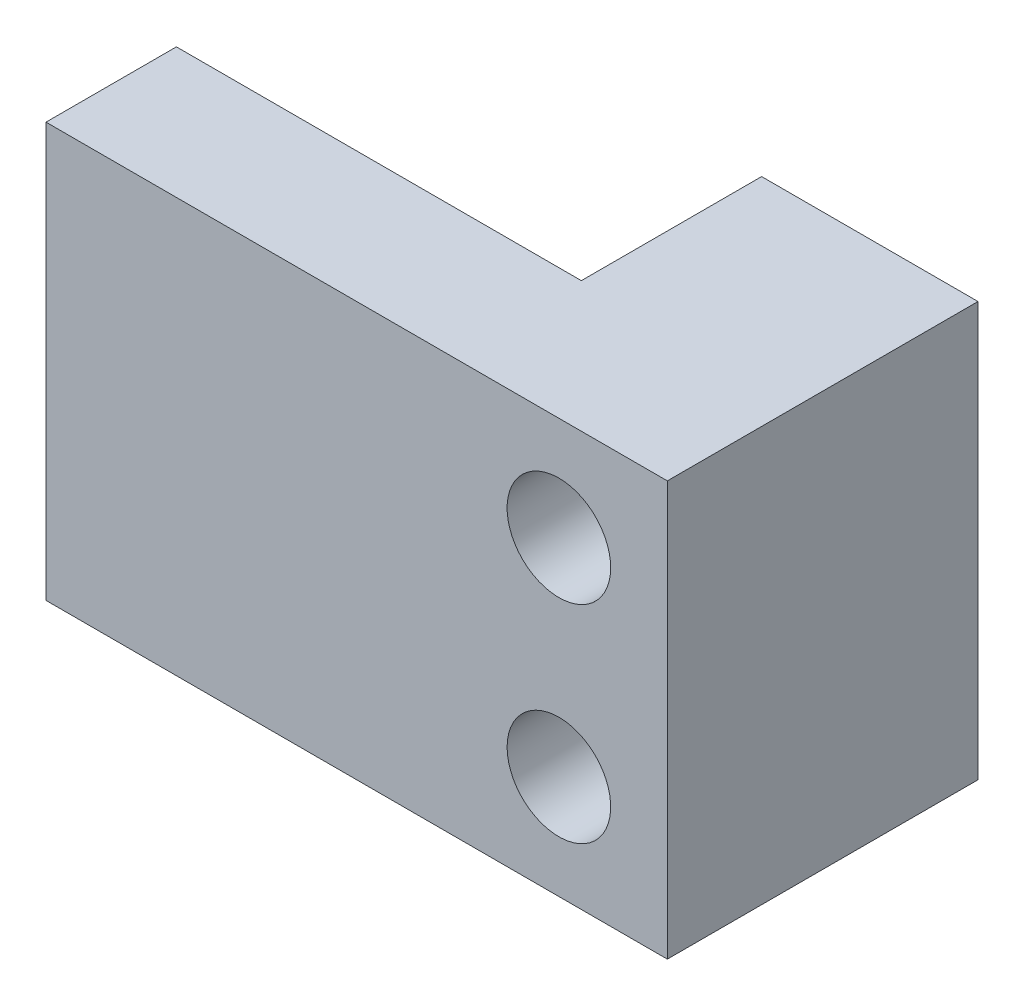
ISO-10303-21;
HEADER;
FILE_DESCRIPTION(('STEP AP214'),'2;1');
FILE_NAME('part.step','',(''),(''),'','','');
FILE_SCHEMA(('AUTOMOTIVE_DESIGN { 1 0 10303 214 1 1 1 1 }'));
ENDSEC;
DATA;
#1=APPLICATION_CONTEXT('core data for automotive mechanical design processes');
#2=APPLICATION_PROTOCOL_DEFINITION('international standard','automotive_design',2000,#1);
#3=PRODUCT_CONTEXT('',#1,'mechanical');
#4=PRODUCT('Part','Part','',(#3));
#5=PRODUCT_RELATED_PRODUCT_CATEGORY('part','',(#4));
#6=PRODUCT_DEFINITION_FORMATION('','',#4);
#7=PRODUCT_DEFINITION_CONTEXT('part definition',#1,'design');
#8=PRODUCT_DEFINITION('design','',#6,#7);
#9=PRODUCT_DEFINITION_SHAPE('','',#8);
#10=(LENGTH_UNIT() NAMED_UNIT(*) SI_UNIT(.MILLI.,.METRE.));
#11=(NAMED_UNIT(*) PLANE_ANGLE_UNIT() SI_UNIT($,.RADIAN.));
#12=(NAMED_UNIT(*) SI_UNIT($,.STERADIAN.) SOLID_ANGLE_UNIT());
#13=UNCERTAINTY_MEASURE_WITH_UNIT(LENGTH_MEASURE(1.E-05),#10,'distance_accuracy_value','');
#14=(GEOMETRIC_REPRESENTATION_CONTEXT(3) GLOBAL_UNCERTAINTY_ASSIGNED_CONTEXT((#13)) GLOBAL_UNIT_ASSIGNED_CONTEXT((#10,
#11,#12)) REPRESENTATION_CONTEXT('',''));
#15=CARTESIAN_POINT('',(0.,0.,0.));
#16=DIRECTION('',(0.,0.,1.));
#17=DIRECTION('',(1.,0.,0.));
#18=AXIS2_PLACEMENT_3D('',#15,#16,#17);
#19=CARTESIAN_POINT('',(0.,0.,15.));
#20=DIRECTION('',(0.,0.,-1.));
#21=DIRECTION('',(-1.,0.,0.));
#22=AXIS2_PLACEMENT_3D('',#19,#20,#21);
#23=PLANE('',#22);
#24=DIRECTION('',(0.,1.,0.));
#25=VECTOR('',#24,1.);
#26=CARTESIAN_POINT('',(15.,-10.,15.));
#27=LINE('',#26,#25);
#28=CARTESIAN_POINT('',(15.,-10.,15.));
#29=VERTEX_POINT('',#28);
#30=CARTESIAN_POINT('',(15.,10.,15.));
#31=VERTEX_POINT('',#30);
#32=EDGE_CURVE('E140',#29,#31,#27,.T.);
#33=ORIENTED_EDGE('',*,*,#32,.T.);
#34=DIRECTION('',(-1.,0.,0.));
#35=VECTOR('',#34,1.);
#36=CARTESIAN_POINT('',(-15.,9.99999999999999,15.));
#37=LINE('',#36,#35);
#38=CARTESIAN_POINT('',(-15.,9.99999999999999,15.));
#39=VERTEX_POINT('',#38);
#40=EDGE_CURVE('E82',#31,#39,#37,.T.);
#41=ORIENTED_EDGE('',*,*,#40,.T.);
#42=DIRECTION('',(0.,-1.,0.));
#43=VECTOR('',#42,1.);
#44=CARTESIAN_POINT('',(-15.,-10.,15.));
#45=LINE('',#44,#43);
#46=CARTESIAN_POINT('',(-15.,-10.,15.));
#47=VERTEX_POINT('',#46);
#48=EDGE_CURVE('E143',#39,#47,#45,.T.);
#49=ORIENTED_EDGE('',*,*,#48,.T.);
#50=DIRECTION('',(1.,0.,0.));
#51=VECTOR('',#50,1.);
#52=CARTESIAN_POINT('',(-15.,-10.,15.));
#53=LINE('',#52,#51);
#54=EDGE_CURVE('E57',#47,#29,#53,.T.);
#55=ORIENTED_EDGE('',*,*,#54,.T.);
#56=EDGE_LOOP('',(#33,#41,#49,#55));
#57=FACE_BOUND('',#56,.T.);
#58=CARTESIAN_POINT('',(9.76381369174453,4.99999999999999,15.));
#59=DIRECTION('',(0.,0.,1.));
#60=DIRECTION('',(1.,0.,0.));
#61=AXIS2_PLACEMENT_3D('',#58,#59,#60);
#62=CIRCLE('',#61,2.5);
#63=CARTESIAN_POINT('',(12.2638136917445,4.99999999999999,15.));
#64=VERTEX_POINT('',#63);
#65=EDGE_CURVE('E134',#64,#64,#62,.T.);
#66=ORIENTED_EDGE('',*,*,#65,.F.);
#67=EDGE_LOOP('',(#66));
#68=FACE_BOUND('',#67,.T.);
#69=CARTESIAN_POINT('',(9.76381369174452,-5.00000000000001,15.));
#70=DIRECTION('',(0.,0.,1.));
#71=DIRECTION('',(-1.,0.,0.));
#72=AXIS2_PLACEMENT_3D('',#69,#70,#71);
#73=CIRCLE('',#72,2.5);
#74=CARTESIAN_POINT('',(7.26381369174452,-5.00000000000001,15.));
#75=VERTEX_POINT('',#74);
#76=EDGE_CURVE('E127',#75,#75,#73,.T.);
#77=ORIENTED_EDGE('',*,*,#76,.F.);
#78=EDGE_LOOP('',(#77));
#79=FACE_BOUND('',#78,.T.);
#80=ADVANCED_FACE('F33',(#57,#68,#79),#23,.F.);
#81=CARTESIAN_POINT('',(0.,0.,0.));
#82=DIRECTION('',(0.,0.,-1.));
#83=DIRECTION('',(-1.,0.,0.));
#84=AXIS2_PLACEMENT_3D('',#81,#82,#83);
#85=PLANE('',#84);
#86=DIRECTION('',(0.,1.,0.));
#87=VECTOR('',#86,1.);
#88=CARTESIAN_POINT('',(4.55213166299018,-1.,0.));
#89=LINE('',#88,#87);
#90=CARTESIAN_POINT('',(4.55213166299018,-1.,0.));
#91=VERTEX_POINT('',#90);
#92=CARTESIAN_POINT('',(4.55213166299018,9.99999999999999,0.));
#93=VERTEX_POINT('',#92);
#94=EDGE_CURVE('E122',#91,#93,#89,.T.);
#95=ORIENTED_EDGE('',*,*,#94,.T.);
#96=DIRECTION('',(-1.,0.,0.));
#97=VECTOR('',#96,1.);
#98=CARTESIAN_POINT('',(-15.,9.99999999999999,0.));
#99=LINE('',#98,#97);
#100=CARTESIAN_POINT('',(15.,10.,0.));
#101=VERTEX_POINT('',#100);
#102=EDGE_CURVE('E149',#101,#93,#99,.T.);
#103=ORIENTED_EDGE('',*,*,#102,.F.);
#104=DIRECTION('',(0.,1.,0.));
#105=VECTOR('',#104,1.);
#106=CARTESIAN_POINT('',(15.,-10.,0.));
#107=LINE('',#106,#105);
#108=CARTESIAN_POINT('',(15.,-10.,0.));
#109=VERTEX_POINT('',#108);
#110=EDGE_CURVE('E137',#109,#101,#107,.T.);
#111=ORIENTED_EDGE('',*,*,#110,.F.);
#112=DIRECTION('',(1.,0.,0.));
#113=VECTOR('',#112,1.);
#114=CARTESIAN_POINT('',(-15.,-10.,0.));
#115=LINE('',#114,#113);
#116=CARTESIAN_POINT('',(-15.,-10.,0.));
#117=VERTEX_POINT('',#116);
#118=EDGE_CURVE('E75',#117,#109,#115,.T.);
#119=ORIENTED_EDGE('',*,*,#118,.F.);
#120=DIRECTION('',(0.,-1.,0.));
#121=VECTOR('',#120,1.);
#122=CARTESIAN_POINT('',(-15.,-10.,0.));
#123=LINE('',#122,#121);
#124=CARTESIAN_POINT('',(-15.,-1.00000000000001,0.));
#125=VERTEX_POINT('',#124);
#126=EDGE_CURVE('E152',#125,#117,#123,.T.);
#127=ORIENTED_EDGE('',*,*,#126,.F.);
#128=DIRECTION('',(-1.,0.,0.));
#129=VECTOR('',#128,1.);
#130=CARTESIAN_POINT('',(-15.,-1.00000000000001,0.));
#131=LINE('',#130,#129);
#132=EDGE_CURVE('E48',#91,#125,#131,.T.);
#133=ORIENTED_EDGE('',*,*,#132,.F.);
#134=EDGE_LOOP('',(#95,#103,#111,#119,#127,#133));
#135=FACE_BOUND('',#134,.T.);
#136=CARTESIAN_POINT('',(9.76381369174453,4.99999999999999,0.));
#137=DIRECTION('',(0.,0.,1.));
#138=DIRECTION('',(1.,0.,0.));
#139=AXIS2_PLACEMENT_3D('',#136,#137,#138);
#140=CIRCLE('',#139,2.5);
#141=CARTESIAN_POINT('',(12.2638136917445,4.99999999999999,0.));
#142=VERTEX_POINT('',#141);
#143=EDGE_CURVE('E130',#142,#142,#140,.T.);
#144=ORIENTED_EDGE('',*,*,#143,.T.);
#145=EDGE_LOOP('',(#144));
#146=FACE_BOUND('',#145,.T.);
#147=CARTESIAN_POINT('',(9.76381369174452,-5.00000000000001,0.));
#148=DIRECTION('',(0.,0.,1.));
#149=DIRECTION('',(-1.,0.,0.));
#150=AXIS2_PLACEMENT_3D('',#147,#148,#149);
#151=CIRCLE('',#150,2.5);
#152=CARTESIAN_POINT('',(7.26381369174452,-5.00000000000001,0.));
#153=VERTEX_POINT('',#152);
#154=EDGE_CURVE('E131',#153,#153,#151,.T.);
#155=ORIENTED_EDGE('',*,*,#154,.T.);
#156=EDGE_LOOP('',(#155));
#157=FACE_BOUND('',#156,.T.);
#158=ADVANCED_FACE('F162',(#135,#146,#157),#85,.T.);
#159=CARTESIAN_POINT('',(15.,-10.,15.));
#160=DIRECTION('',(-1.,0.,0.));
#161=DIRECTION('',(0.,-1.,0.));
#162=AXIS2_PLACEMENT_3D('',#159,#160,#161);
#163=PLANE('',#162);
#164=ORIENTED_EDGE('',*,*,#110,.T.);
#165=DIRECTION('',(0.,0.,-1.));
#166=VECTOR('',#165,1.);
#167=CARTESIAN_POINT('',(15.,10.,15.));
#168=LINE('',#167,#166);
#169=EDGE_CURVE('E11',#31,#101,#168,.T.);
#170=ORIENTED_EDGE('',*,*,#169,.F.);
#171=ORIENTED_EDGE('',*,*,#32,.F.);
#172=DIRECTION('',(0.,0.,-1.));
#173=VECTOR('',#172,1.);
#174=CARTESIAN_POINT('',(15.,-10.,15.));
#175=LINE('',#174,#173);
#176=EDGE_CURVE('E146',#29,#109,#175,.T.);
#177=ORIENTED_EDGE('',*,*,#176,.T.);
#178=EDGE_LOOP('',(#164,#170,#171,#177));
#179=FACE_BOUND('',#178,.T.);
#180=ADVANCED_FACE('F35',(#179),#163,.F.);
#181=CARTESIAN_POINT('',(-15.,9.99999999999999,15.));
#182=DIRECTION('',(0.,-1.,0.));
#183=DIRECTION('',(1.,0.,0.));
#184=AXIS2_PLACEMENT_3D('',#181,#182,#183);
#185=PLANE('',#184);
#186=ORIENTED_EDGE('',*,*,#102,.T.);
#187=DIRECTION('',(0.,0.,-1.));
#188=VECTOR('',#187,1.);
#189=CARTESIAN_POINT('',(4.55213166299018,9.99999999999999,0.));
#190=LINE('',#189,#188);
#191=CARTESIAN_POINT('',(4.55213166299018,9.99999999999999,8.70327388733472));
#192=VERTEX_POINT('',#191);
#193=EDGE_CURVE('E116',#192,#93,#190,.T.);
#194=ORIENTED_EDGE('',*,*,#193,.F.);
#195=DIRECTION('',(1.,0.,0.));
#196=VECTOR('',#195,1.);
#197=CARTESIAN_POINT('',(-15.,9.99999999999999,8.70327388733472));
#198=LINE('',#197,#196);
#199=CARTESIAN_POINT('',(-15.,9.99999999999999,8.70327388733472));
#200=VERTEX_POINT('',#199);
#201=EDGE_CURVE('E170',#200,#192,#198,.T.);
#202=ORIENTED_EDGE('',*,*,#201,.F.);
#203=DIRECTION('',(0.,0.,-1.));
#204=VECTOR('',#203,1.);
#205=CARTESIAN_POINT('',(-15.,9.99999999999999,15.));
#206=LINE('',#205,#204);
#207=EDGE_CURVE('E41',#39,#200,#206,.T.);
#208=ORIENTED_EDGE('',*,*,#207,.F.);
#209=ORIENTED_EDGE('',*,*,#40,.F.);
#210=ORIENTED_EDGE('',*,*,#169,.T.);
#211=EDGE_LOOP('',(#186,#194,#202,#208,#209,#210));
#212=FACE_BOUND('',#211,.T.);
#213=ADVANCED_FACE('F168',(#212),#185,.F.);
#214=CARTESIAN_POINT('',(-15.,-10.,15.));
#215=DIRECTION('',(1.,0.,0.));
#216=DIRECTION('',(0.,1.,0.));
#217=AXIS2_PLACEMENT_3D('',#214,#215,#216);
#218=PLANE('',#217);
#219=ORIENTED_EDGE('',*,*,#207,.T.);
#220=DIRECTION('',(0.,1.,0.));
#221=VECTOR('',#220,1.);
#222=CARTESIAN_POINT('',(-15.,-1.00000000000001,8.70327388733472));
#223=LINE('',#222,#221);
#224=CARTESIAN_POINT('',(-15.,-1.00000000000001,8.70327388733472));
#225=VERTEX_POINT('',#224);
#226=EDGE_CURVE('E106',#225,#200,#223,.T.);
#227=ORIENTED_EDGE('',*,*,#226,.F.);
#228=DIRECTION('',(0.,0.,1.));
#229=VECTOR('',#228,1.);
#230=CARTESIAN_POINT('',(-15.,-1.00000000000001,0.));
#231=LINE('',#230,#229);
#232=EDGE_CURVE('E111',#125,#225,#231,.T.);
#233=ORIENTED_EDGE('',*,*,#232,.F.);
#234=ORIENTED_EDGE('',*,*,#126,.T.);
#235=DIRECTION('',(0.,0.,-1.));
#236=VECTOR('',#235,1.);
#237=CARTESIAN_POINT('',(-15.,-10.,15.));
#238=LINE('',#237,#236);
#239=EDGE_CURVE('E156',#47,#117,#238,.T.);
#240=ORIENTED_EDGE('',*,*,#239,.F.);
#241=ORIENTED_EDGE('',*,*,#48,.F.);
#242=EDGE_LOOP('',(#219,#227,#233,#234,#240,#241));
#243=FACE_BOUND('',#242,.T.);
#244=ADVANCED_FACE('F119',(#243),#218,.F.);
#245=CARTESIAN_POINT('',(-15.,-10.,15.));
#246=DIRECTION('',(0.,1.,0.));
#247=DIRECTION('',(-1.,0.,0.));
#248=AXIS2_PLACEMENT_3D('',#245,#246,#247);
#249=PLANE('',#248);
#250=ORIENTED_EDGE('',*,*,#118,.T.);
#251=ORIENTED_EDGE('',*,*,#176,.F.);
#252=ORIENTED_EDGE('',*,*,#54,.F.);
#253=ORIENTED_EDGE('',*,*,#239,.T.);
#254=EDGE_LOOP('',(#250,#251,#252,#253));
#255=FACE_BOUND('',#254,.T.);
#256=ADVANCED_FACE('F158',(#255),#249,.F.);
#257=CARTESIAN_POINT('',(9.76381369174453,4.99999999999999,15.));
#258=DIRECTION('',(0.,0.,-1.));
#259=DIRECTION('',(-1.,0.,0.));
#260=AXIS2_PLACEMENT_3D('',#257,#258,#259);
#261=CYLINDRICAL_SURFACE('',#260,2.5);
#262=ORIENTED_EDGE('',*,*,#65,.T.);
#263=EDGE_LOOP('',(#262));
#264=FACE_BOUND('',#263,.T.);
#265=ORIENTED_EDGE('',*,*,#143,.F.);
#266=EDGE_LOOP('',(#265));
#267=FACE_BOUND('',#266,.T.);
#268=ADVANCED_FACE('F184',(#264,#267),#261,.F.);
#269=CARTESIAN_POINT('',(9.76381369174452,-5.00000000000001,15.));
#270=DIRECTION('',(0.,0.,-1.));
#271=DIRECTION('',(-1.,0.,0.));
#272=AXIS2_PLACEMENT_3D('',#269,#270,#271);
#273=CYLINDRICAL_SURFACE('',#272,2.5);
#274=ORIENTED_EDGE('',*,*,#76,.T.);
#275=EDGE_LOOP('',(#274));
#276=FACE_BOUND('',#275,.T.);
#277=ORIENTED_EDGE('',*,*,#154,.F.);
#278=EDGE_LOOP('',(#277));
#279=FACE_BOUND('',#278,.T.);
#280=ADVANCED_FACE('F177',(#276,#279),#273,.F.);
#281=CARTESIAN_POINT('',(4.55213166299018,-1.,0.));
#282=DIRECTION('',(1.,0.,0.));
#283=DIRECTION('',(0.,1.,0.));
#284=AXIS2_PLACEMENT_3D('',#281,#282,#283);
#285=PLANE('',#284);
#286=ORIENTED_EDGE('',*,*,#193,.T.);
#287=ORIENTED_EDGE('',*,*,#94,.F.);
#288=DIRECTION('',(0.,0.,-1.));
#289=VECTOR('',#288,1.);
#290=CARTESIAN_POINT('',(4.55213166299018,-1.,0.));
#291=LINE('',#290,#289);
#292=CARTESIAN_POINT('',(4.55213166299018,-1.,8.70327388733472));
#293=VERTEX_POINT('',#292);
#294=EDGE_CURVE('E110',#293,#91,#291,.T.);
#295=ORIENTED_EDGE('',*,*,#294,.F.);
#296=DIRECTION('',(0.,1.,0.));
#297=VECTOR('',#296,1.);
#298=CARTESIAN_POINT('',(4.55213166299018,-1.,8.70327388733472));
#299=LINE('',#298,#297);
#300=EDGE_CURVE('E108',#293,#192,#299,.T.);
#301=ORIENTED_EDGE('',*,*,#300,.T.);
#302=EDGE_LOOP('',(#286,#287,#295,#301));
#303=FACE_BOUND('',#302,.T.);
#304=ADVANCED_FACE('F175',(#303),#285,.F.);
#305=CARTESIAN_POINT('',(-15.,-1.00000000000001,8.70327388733472));
#306=DIRECTION('',(0.,0.,1.));
#307=DIRECTION('',(1.,0.,0.));
#308=AXIS2_PLACEMENT_3D('',#305,#306,#307);
#309=PLANE('',#308);
#310=ORIENTED_EDGE('',*,*,#201,.T.);
#311=ORIENTED_EDGE('',*,*,#300,.F.);
#312=DIRECTION('',(1.,0.,0.));
#313=VECTOR('',#312,1.);
#314=CARTESIAN_POINT('',(-15.,-1.00000000000001,8.70327388733472));
#315=LINE('',#314,#313);
#316=EDGE_CURVE('E102',#225,#293,#315,.T.);
#317=ORIENTED_EDGE('',*,*,#316,.F.);
#318=ORIENTED_EDGE('',*,*,#226,.T.);
#319=EDGE_LOOP('',(#310,#311,#317,#318));
#320=FACE_BOUND('',#319,.T.);
#321=ADVANCED_FACE('F104',(#320),#309,.F.);
#322=CARTESIAN_POINT('',(0.,-1.,0.));
#323=DIRECTION('',(0.,1.,0.));
#324=DIRECTION('',(-1.,0.,0.));
#325=AXIS2_PLACEMENT_3D('',#322,#323,#324);
#326=PLANE('',#325);
#327=ORIENTED_EDGE('',*,*,#232,.T.);
#328=ORIENTED_EDGE('',*,*,#316,.T.);
#329=ORIENTED_EDGE('',*,*,#294,.T.);
#330=ORIENTED_EDGE('',*,*,#132,.T.);
#331=EDGE_LOOP('',(#327,#328,#329,#330));
#332=FACE_BOUND('',#331,.T.);
#333=ADVANCED_FACE('F113',(#332),#326,.T.);
#334=CLOSED_SHELL('',(#80,#158,#180,#213,#244,#256,#268,#280,#304,#321,#333));
#335=MANIFOLD_SOLID_BREP('B2',#334);
#336=ADVANCED_BREP_SHAPE_REPRESENTATION('',(#18,#335),#14);
#337=SHAPE_DEFINITION_REPRESENTATION(#9,#336);
ENDSEC;
END-ISO-10303-21;
